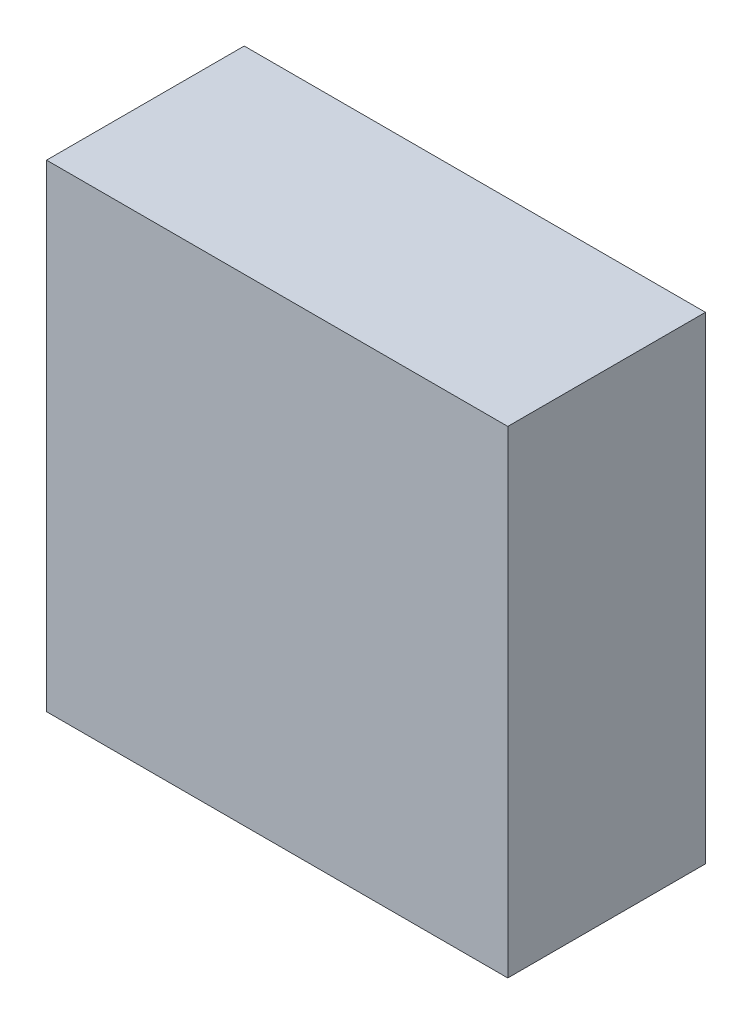
ISO-10303-21;
HEADER;
FILE_DESCRIPTION(('STEP AP214'),'2;1');
FILE_NAME('part.step','',(''),(''),'','','');
FILE_SCHEMA(('AUTOMOTIVE_DESIGN { 1 0 10303 214 1 1 1 1 }'));
ENDSEC;
DATA;
#1=APPLICATION_CONTEXT('core data for automotive mechanical design processes');
#2=APPLICATION_PROTOCOL_DEFINITION('international standard','automotive_design',2000,#1);
#3=PRODUCT_CONTEXT('',#1,'mechanical');
#4=PRODUCT('Part','Part','',(#3));
#5=PRODUCT_RELATED_PRODUCT_CATEGORY('part','',(#4));
#6=PRODUCT_DEFINITION_FORMATION('','',#4);
#7=PRODUCT_DEFINITION_CONTEXT('part definition',#1,'design');
#8=PRODUCT_DEFINITION('design','',#6,#7);
#9=PRODUCT_DEFINITION_SHAPE('','',#8);
#10=(LENGTH_UNIT() NAMED_UNIT(*) SI_UNIT(.MILLI.,.METRE.));
#11=(NAMED_UNIT(*) PLANE_ANGLE_UNIT() SI_UNIT($,.RADIAN.));
#12=(NAMED_UNIT(*) SI_UNIT($,.STERADIAN.) SOLID_ANGLE_UNIT());
#13=UNCERTAINTY_MEASURE_WITH_UNIT(LENGTH_MEASURE(1.E-05),#10,'distance_accuracy_value','');
#14=(GEOMETRIC_REPRESENTATION_CONTEXT(3) GLOBAL_UNCERTAINTY_ASSIGNED_CONTEXT((#13)) GLOBAL_UNIT_ASSIGNED_CONTEXT((#10,
#11,#12)) REPRESENTATION_CONTEXT('',''));
#15=CARTESIAN_POINT('',(0.,0.,0.));
#16=DIRECTION('',(0.,0.,1.));
#17=DIRECTION('',(1.,0.,0.));
#18=AXIS2_PLACEMENT_3D('',#15,#16,#17);
#19=CARTESIAN_POINT('',(-0.699987041969848,0.725000254301008,0.));
#20=DIRECTION('',(-1.,8.74227765734759E-08,0.));
#21=DIRECTION('',(-8.74227765734759E-08,-1.,0.));
#22=AXIS2_PLACEMENT_3D('',#19,#20,#21);
#23=PLANE('',#22);
#24=DIRECTION('',(-8.74227766086187E-08,-0.999999999999996,0.));
#25=VECTOR('',#24,1.);
#26=CARTESIAN_POINT('',(-0.699987041969848,0.725000254301008,0.));
#27=LINE('',#26,#25);
#28=CARTESIAN_POINT('',(-0.699987041969848,0.725000254301008,0.));
#29=VERTEX_POINT('',#28);
#30=CARTESIAN_POINT('',(-0.699987168732605,-0.724996693941179,0.));
#31=VERTEX_POINT('',#30);
#32=EDGE_CURVE('E11',#29,#31,#27,.T.);
#33=ORIENTED_EDGE('',*,*,#32,.T.);
#34=DIRECTION('',(0.,0.,1.));
#35=VECTOR('',#34,1.);
#36=CARTESIAN_POINT('',(-0.699987168732608,-0.724996693941179,0.));
#37=LINE('',#36,#35);
#38=CARTESIAN_POINT('',(-0.699987168732605,-0.724996693941179,0.599998772144318));
#39=VERTEX_POINT('',#38);
#40=EDGE_CURVE('E88',#31,#39,#37,.T.);
#41=ORIENTED_EDGE('',*,*,#40,.T.);
#42=DIRECTION('',(-8.74227766086187E-08,-0.999999999999996,0.));
#43=VECTOR('',#42,1.);
#44=CARTESIAN_POINT('',(-0.699987041969848,0.725000254301008,0.599998772144318));
#45=LINE('',#44,#43);
#46=CARTESIAN_POINT('',(-0.699987041969848,0.725000254301008,0.599998772144318));
#47=VERTEX_POINT('',#46);
#48=EDGE_CURVE('E83',#47,#39,#45,.T.);
#49=ORIENTED_EDGE('',*,*,#48,.F.);
#50=DIRECTION('',(0.,0.,1.));
#51=VECTOR('',#50,1.);
#52=CARTESIAN_POINT('',(-0.699987041969848,0.72500025430101,0.));
#53=LINE('',#52,#51);
#54=EDGE_CURVE('E72',#29,#47,#53,.T.);
#55=ORIENTED_EDGE('',*,*,#54,.F.);
#56=EDGE_LOOP('',(#33,#41,#49,#55));
#57=FACE_BOUND('',#56,.T.);
#58=ADVANCED_FACE('F17',(#57),#23,.T.);
#59=CARTESIAN_POINT('',(-0.699987168732605,-0.724996693941179,0.));
#60=DIRECTION('',(-8.74227765734759E-08,-1.,0.));
#61=DIRECTION('',(1.,-8.74227765734759E-08,0.));
#62=AXIS2_PLACEMENT_3D('',#59,#60,#61);
#63=PLANE('',#62);
#64=DIRECTION('',(0.999999999999996,-8.74227765994959E-08,0.));
#65=VECTOR('',#64,1.);
#66=CARTESIAN_POINT('',(-0.699987168732605,-0.724996693941179,0.));
#67=LINE('',#66,#65);
#68=CARTESIAN_POINT('',(0.700037245329895,-0.724996816335199,0.));
#69=VERTEX_POINT('',#68);
#70=EDGE_CURVE('E24',#31,#69,#67,.T.);
#71=ORIENTED_EDGE('',*,*,#70,.T.);
#72=DIRECTION('',(0.,0.,1.));
#73=VECTOR('',#72,1.);
#74=CARTESIAN_POINT('',(0.700037245329895,-0.724996816335201,0.));
#75=LINE('',#74,#73);
#76=CARTESIAN_POINT('',(0.700037245329895,-0.724996816335199,0.599998772144318));
#77=VERTEX_POINT('',#76);
#78=EDGE_CURVE('E85',#69,#77,#75,.T.);
#79=ORIENTED_EDGE('',*,*,#78,.T.);
#80=DIRECTION('',(0.999999999999996,-8.74227765994959E-08,0.));
#81=VECTOR('',#80,1.);
#82=CARTESIAN_POINT('',(-0.699987168732605,-0.724996693941179,0.599998772144318));
#83=LINE('',#82,#81);
#84=EDGE_CURVE('E66',#39,#77,#83,.T.);
#85=ORIENTED_EDGE('',*,*,#84,.F.);
#86=ORIENTED_EDGE('',*,*,#40,.F.);
#87=EDGE_LOOP('',(#71,#79,#85,#86));
#88=FACE_BOUND('',#87,.T.);
#89=ADVANCED_FACE('F89',(#88),#63,.T.);
#90=CARTESIAN_POINT('',(0.700037245329895,-0.724996816335199,0.));
#91=DIRECTION('',(1.,-8.74227765734759E-08,0.));
#92=DIRECTION('',(8.74227765734759E-08,1.,0.));
#93=AXIS2_PLACEMENT_3D('',#90,#91,#92);
#94=PLANE('',#93);
#95=DIRECTION('',(8.74227766086187E-08,0.999999999999996,0.));
#96=VECTOR('',#95,1.);
#97=CARTESIAN_POINT('',(0.700037245329895,-0.724996816335199,0.));
#98=LINE('',#97,#96);
#99=CARTESIAN_POINT('',(0.700037372092652,0.725000131906988,0.));
#100=VERTEX_POINT('',#99);
#101=EDGE_CURVE('E62',#69,#100,#98,.T.);
#102=ORIENTED_EDGE('',*,*,#101,.T.);
#103=DIRECTION('',(0.,0.,1.));
#104=VECTOR('',#103,1.);
#105=CARTESIAN_POINT('',(0.700037372092654,0.725000131906988,0.));
#106=LINE('',#105,#104);
#107=CARTESIAN_POINT('',(0.700037372092652,0.725000131906988,0.599998772144318));
#108=VERTEX_POINT('',#107);
#109=EDGE_CURVE('E55',#100,#108,#106,.T.);
#110=ORIENTED_EDGE('',*,*,#109,.T.);
#111=DIRECTION('',(8.74227766086187E-08,0.999999999999996,0.));
#112=VECTOR('',#111,1.);
#113=CARTESIAN_POINT('',(0.700037245329895,-0.724996816335199,0.599998772144318));
#114=LINE('',#113,#112);
#115=EDGE_CURVE('E59',#77,#108,#114,.T.);
#116=ORIENTED_EDGE('',*,*,#115,.F.);
#117=ORIENTED_EDGE('',*,*,#78,.F.);
#118=EDGE_LOOP('',(#102,#110,#116,#117));
#119=FACE_BOUND('',#118,.T.);
#120=ADVANCED_FACE('F57',(#119),#94,.T.);
#121=CARTESIAN_POINT('',(0.700037372092652,0.725000131906988,0.));
#122=DIRECTION('',(8.74227765734759E-08,1.,0.));
#123=DIRECTION('',(-1.,8.74227765734759E-08,0.));
#124=AXIS2_PLACEMENT_3D('',#121,#122,#123);
#125=PLANE('',#124);
#126=DIRECTION('',(-0.999999999999996,8.74227765994959E-08,0.));
#127=VECTOR('',#126,1.);
#128=CARTESIAN_POINT('',(0.700037372092652,0.725000131906988,0.));
#129=LINE('',#128,#127);
#130=EDGE_CURVE('E65',#100,#29,#129,.T.);
#131=ORIENTED_EDGE('',*,*,#130,.T.);
#132=ORIENTED_EDGE('',*,*,#54,.T.);
#133=DIRECTION('',(-0.999999999999996,8.74227765994959E-08,0.));
#134=VECTOR('',#133,1.);
#135=CARTESIAN_POINT('',(0.700037372092652,0.725000131906988,0.599998772144318));
#136=LINE('',#135,#134);
#137=EDGE_CURVE('E70',#108,#47,#136,.T.);
#138=ORIENTED_EDGE('',*,*,#137,.F.);
#139=ORIENTED_EDGE('',*,*,#109,.F.);
#140=EDGE_LOOP('',(#131,#132,#138,#139));
#141=FACE_BOUND('',#140,.T.);
#142=ADVANCED_FACE('F71',(#141),#125,.T.);
#143=CARTESIAN_POINT('',(412.378356933594,61.9506187438965,0.599998772144318));
#144=DIRECTION('',(0.,0.,1.));
#145=DIRECTION('',(-1.,8.74227765734759E-08,0.));
#146=AXIS2_PLACEMENT_3D('',#143,#144,#145);
#147=PLANE('',#146);
#148=ORIENTED_EDGE('',*,*,#48,.T.);
#149=ORIENTED_EDGE('',*,*,#84,.T.);
#150=ORIENTED_EDGE('',*,*,#115,.T.);
#151=ORIENTED_EDGE('',*,*,#137,.T.);
#152=EDGE_LOOP('',(#148,#149,#150,#151));
#153=FACE_BOUND('',#152,.T.);
#154=ADVANCED_FACE('F76',(#153),#147,.T.);
#155=CARTESIAN_POINT('',(412.378356933594,61.9506187438965,0.));
#156=DIRECTION('',(0.,0.,1.));
#157=DIRECTION('',(-1.,8.74227765734759E-08,0.));
#158=AXIS2_PLACEMENT_3D('',#155,#156,#157);
#159=PLANE('',#158);
#160=ORIENTED_EDGE('',*,*,#130,.F.);
#161=ORIENTED_EDGE('',*,*,#101,.F.);
#162=ORIENTED_EDGE('',*,*,#70,.F.);
#163=ORIENTED_EDGE('',*,*,#32,.F.);
#164=EDGE_LOOP('',(#160,#161,#162,#163));
#165=FACE_BOUND('',#164,.T.);
#166=ADVANCED_FACE('F91',(#165),#159,.F.);
#167=CLOSED_SHELL('',(#58,#89,#120,#142,#154,#166));
#168=MANIFOLD_SOLID_BREP('B1',#167);
#169=ADVANCED_BREP_SHAPE_REPRESENTATION('',(#18,#168),#14);
#170=SHAPE_DEFINITION_REPRESENTATION(#9,#169);
ENDSEC;
END-ISO-10303-21;
